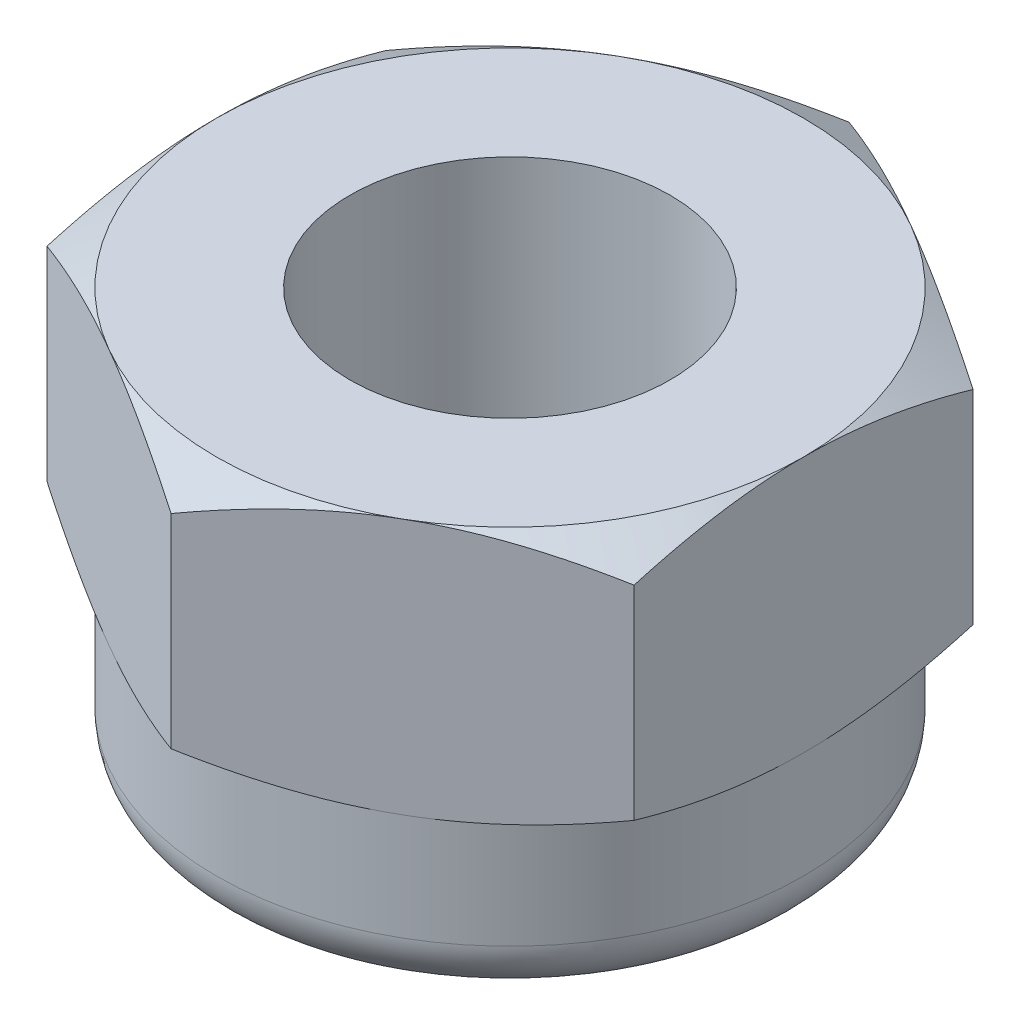
ISO-10303-21;
HEADER;
FILE_DESCRIPTION(('STEP AP214'),'2;1');
FILE_NAME('part.step','',(''),(''),'','','');
FILE_SCHEMA(('AUTOMOTIVE_DESIGN { 1 0 10303 214 1 1 1 1 }'));
ENDSEC;
DATA;
#1=APPLICATION_CONTEXT('core data for automotive mechanical design processes');
#2=APPLICATION_PROTOCOL_DEFINITION('international standard','automotive_design',2000,#1);
#3=PRODUCT_CONTEXT('',#1,'mechanical');
#4=PRODUCT('Part','Part','',(#3));
#5=PRODUCT_RELATED_PRODUCT_CATEGORY('part','',(#4));
#6=PRODUCT_DEFINITION_FORMATION('','',#4);
#7=PRODUCT_DEFINITION_CONTEXT('part definition',#1,'design');
#8=PRODUCT_DEFINITION('design','',#6,#7);
#9=PRODUCT_DEFINITION_SHAPE('','',#8);
#10=(LENGTH_UNIT() NAMED_UNIT(*) SI_UNIT(.MILLI.,.METRE.));
#11=(NAMED_UNIT(*) PLANE_ANGLE_UNIT() SI_UNIT($,.RADIAN.));
#12=(NAMED_UNIT(*) SI_UNIT($,.STERADIAN.) SOLID_ANGLE_UNIT());
#13=UNCERTAINTY_MEASURE_WITH_UNIT(LENGTH_MEASURE(1.E-05),#10,'distance_accuracy_value','');
#14=(GEOMETRIC_REPRESENTATION_CONTEXT(3) GLOBAL_UNCERTAINTY_ASSIGNED_CONTEXT((#13)) GLOBAL_UNIT_ASSIGNED_CONTEXT((#10,
#11,#12)) REPRESENTATION_CONTEXT('',''));
#15=CARTESIAN_POINT('',(0.,0.,0.));
#16=DIRECTION('',(0.,0.,1.));
#17=DIRECTION('',(1.,0.,0.));
#18=AXIS2_PLACEMENT_3D('',#15,#16,#17);
#19=CARTESIAN_POINT('',(2.75,2.4,1.58771324027147));
#20=DIRECTION('',(-1.,0.,0.));
#21=DIRECTION('',(0.,0.,1.));
#22=AXIS2_PLACEMENT_3D('',#19,#20,#21);
#23=PLANE('',#22);
#24=CARTESIAN_POINT('',(2.75,1.38093653958843,-4.34466851973618));
#25=CARTESIAN_POINT('',(2.75,1.32202064950724,-4.22386779698329));
#26=CARTESIAN_POINT('',(2.75,1.26364700999932,-4.10279820576392));
#27=CARTESIAN_POINT('',(2.75,1.1482876774291,-3.85997860192461));
#28=CARTESIAN_POINT('',(2.75,1.09130218842708,-3.73822849246315));
#29=CARTESIAN_POINT('',(2.75,0.978752723293785,-3.49331526441921));
#30=CARTESIAN_POINT('',(2.75,0.923197515155515,-3.37014810316777));
#31=CARTESIAN_POINT('',(2.75,0.814256244023592,-3.12286173431569));
#32=CARTESIAN_POINT('',(2.75,0.760870083644363,-2.99874256975606));
#33=CARTESIAN_POINT('',(2.75,0.655040057447403,-2.74504756832828));
#34=CARTESIAN_POINT('',(2.75,0.602692465793724,-2.61543135851998));
#35=CARTESIAN_POINT('',(2.75,0.501769184528043,-2.3547122248499));
#36=CARTESIAN_POINT('',(2.75,0.453193906922892,-2.22360914038081));
#37=CARTESIAN_POINT('',(2.75,0.361032320926383,-1.95992838631145));
#38=CARTESIAN_POINT('',(2.75,0.317436563028729,-1.82735405172156));
#39=CARTESIAN_POINT('',(2.75,0.236579903230572,-1.56030503468424));
#40=CARTESIAN_POINT('',(2.75,0.19931708834281,-1.42583093943772));
#41=CARTESIAN_POINT('',(2.75,0.13306472074465,-1.15567205992232));
#42=CARTESIAN_POINT('',(2.75,0.104027276748661,-1.01999923443433));
#43=CARTESIAN_POINT('',(2.75,0.0558064271323427,-0.74688545575803));
#44=CARTESIAN_POINT('',(2.75,0.0366219648340766,-0.60944469379236));
#45=CARTESIAN_POINT('',(2.75,0.00988438809777827,-0.335308015782439));
#46=CARTESIAN_POINT('',(2.75,0.00217562219202506,-0.198627665157731));
#47=CARTESIAN_POINT('',(2.75,-0.00137225152806814,0.0749013422897878));
#48=CARTESIAN_POINT('',(2.75,0.00278868640387965,0.211749999759228));
#49=CARTESIAN_POINT('',(2.75,0.0194575166846125,0.441773738270723));
#50=CARTESIAN_POINT('',(2.75,0.0289378796806116,0.535183717161857));
#51=CARTESIAN_POINT('',(2.75,0.0528801300146094,0.721369109747204));
#52=CARTESIAN_POINT('',(2.75,0.0673426297137116,0.814144444006141));
#53=CARTESIAN_POINT('',(2.75,0.117450471333739,1.09135512594781));
#54=CARTESIAN_POINT('',(2.75,0.159808531169033,1.27458276750907));
#55=CARTESIAN_POINT('',(2.75,0.258901006196716,1.64148663937185));
#56=CARTESIAN_POINT('',(2.75,0.315943538456145,1.82507634432752));
#57=CARTESIAN_POINT('',(2.75,0.408810753757667,2.09789707107598));
#58=CARTESIAN_POINT('',(2.75,0.440981048739553,2.1884033337036));
#59=CARTESIAN_POINT('',(2.75,0.507377444516064,2.3686579485815));
#60=CARTESIAN_POINT('',(2.75,0.541603508874817,2.45840631423238));
#61=CARTESIAN_POINT('',(2.75,0.630917375568816,2.68603060571207));
#62=CARTESIAN_POINT('',(2.75,0.687195514965079,2.82343831755756));
#63=CARTESIAN_POINT('',(2.75,0.802882890715629,3.09693392822121));
#64=CARTESIAN_POINT('',(2.75,0.862292397407977,3.23302171188218));
#65=CARTESIAN_POINT('',(2.75,0.983551766352992,3.50414955291982));
#66=CARTESIAN_POINT('',(2.75,1.04540233123311,3.63918929504804));
#67=CARTESIAN_POINT('',(2.75,1.17101091756355,3.90838031374437));
#68=CARTESIAN_POINT('',(2.75,1.23476899108964,4.04253156593401));
#69=CARTESIAN_POINT('',(2.75,1.42847314195053,4.44426655928707));
#70=CARTESIAN_POINT('',(2.75,1.56067980896763,4.71075917718014));
#71=CARTESIAN_POINT('',(2.75,1.82899066695537,5.24170253784735));
#72=CARTESIAN_POINT('',(2.75,1.96509418383273,5.50615362384512));
#73=CARTESIAN_POINT('',(2.75,2.22681256839317,6.00831212761472));
#74=CARTESIAN_POINT('',(2.75,2.35217952114007,6.24614899547915));
#75=CARTESIAN_POINT('',(2.75,2.60455330317852,6.72096498096079));
#76=CARTESIAN_POINT('',(2.75,2.73156021492778,6.95794405467475));
#77=CARTESIAN_POINT('',(2.75,2.98641132805265,7.43050913308614));
#78=CARTESIAN_POINT('',(2.75,3.11425174665986,7.66609718039577));
#79=CARTESIAN_POINT('',(2.75,3.37088488435897,8.13673291173544));
#80=CARTESIAN_POINT('',(2.75,3.49967753635213,8.37178063233783));
#81=CARTESIAN_POINT('',(2.75,3.62882004293521,8.60663456203462));
#82=B_SPLINE_CURVE_WITH_KNOTS('',3,(#24,#25,#26,#27,#28,#29,#30,#31,#32,#33,#34,#35,#36,#37,#38,
#39,#40,#41,#42,#43,#44,#45,#46,#47,#48,#49,#50,#51,#52,#53,#54,#55,#56,#57,#58,#59,#60,#61,#62,
#63,#64,#65,#66,#67,#68,#69,#70,#71,#72,#73,#74,#75,#76,#77,#78,#79,#80,#81),.UNSPECIFIED.,.F.,
.F.,(4,2,2,2,2,2,2,2,2,2,2,2,2,2,2,2,2,2,2,2,2,2,2,2,2,2,2,2,4),(0.,0.403210544384672,
0.806480007959044,1.21181340797903,1.61712858924554,2.03644659555967,2.45581033497737,
2.87436455094914,3.29279210898127,3.70873084748665,4.1246249695373,4.53482498455775,
4.94502658050672,5.22656210678562,5.50813224932743,6.07154932122723,6.64791901572732,
6.93606075698111,7.22419739279862,7.66960137467362,8.11504387247217,8.56061553390865,
9.00619937075532,9.89859388845236,10.7908349577555,11.5973926448137,12.4039910450292,
13.2081055813639,14.0121639860803),.UNSPECIFIED.);
#83=CARTESIAN_POINT('',(2.75,0.245620093061801,-1.58771324027157));
#84=VERTEX_POINT('',#83);
#85=CARTESIAN_POINT('',(2.75,0.,0.));
#86=VERTEX_POINT('',#85);
#87=EDGE_CURVE('E148',#84,#86,#82,.T.);
#88=ORIENTED_EDGE('',*,*,#87,.F.);
#89=DIRECTION('',(0.,-1.,0.));
#90=VECTOR('',#89,1.);
#91=CARTESIAN_POINT('',(2.75,2.4,-1.58771324027147));
#92=LINE('',#91,#90);
#93=CARTESIAN_POINT('',(2.75,2.15437990693814,-1.58771324027147));
#94=VERTEX_POINT('',#93);
#95=EDGE_CURVE('E157',#94,#84,#92,.T.);
#96=ORIENTED_EDGE('',*,*,#95,.F.);
#97=CARTESIAN_POINT('',(2.75,1.0190634604116,-4.34466851973617));
#98=CARTESIAN_POINT('',(2.75,1.07797935049279,-4.22386779698328));
#99=CARTESIAN_POINT('',(2.75,1.13635299000071,-4.10279820576392));
#100=CARTESIAN_POINT('',(2.75,1.25171232257092,-3.8599786019246));
#101=CARTESIAN_POINT('',(2.75,1.30869781157294,-3.73822849246315));
#102=CARTESIAN_POINT('',(2.75,1.42124727670623,-3.4933152644192));
#103=CARTESIAN_POINT('',(2.75,1.4768024848445,-3.37014810316777));
#104=CARTESIAN_POINT('',(2.75,1.58574375597642,-3.12286173431569));
#105=CARTESIAN_POINT('',(2.75,1.63912991635565,-2.99874256975605));
#106=CARTESIAN_POINT('',(2.75,1.74495994255261,-2.74504756832828));
#107=CARTESIAN_POINT('',(2.75,1.79730753420629,-2.61543135851997));
#108=CARTESIAN_POINT('',(2.75,1.89823081547197,-2.35471222484989));
#109=CARTESIAN_POINT('',(2.75,1.94680609307712,-2.22360914038081));
#110=CARTESIAN_POINT('',(2.75,2.03896767907362,-1.95992838631144));
#111=CARTESIAN_POINT('',(2.75,2.08256343697128,-1.82735405172156));
#112=CARTESIAN_POINT('',(2.75,2.16342009676943,-1.56030503468424));
#113=CARTESIAN_POINT('',(2.75,2.20068291165719,-1.42583093943771));
#114=CARTESIAN_POINT('',(2.75,2.26693527925535,-1.15567205992232));
#115=CARTESIAN_POINT('',(2.75,2.29597272325134,-1.01999923443432));
#116=CARTESIAN_POINT('',(2.75,2.34419357286766,-0.746885455758027));
#117=CARTESIAN_POINT('',(2.75,2.36337803516592,-0.609444693792359));
#118=CARTESIAN_POINT('',(2.75,2.39011561190222,-0.335308015782438));
#119=CARTESIAN_POINT('',(2.75,2.39782437780797,-0.198627665157731));
#120=CARTESIAN_POINT('',(2.75,2.40137225152807,0.0749013422897874));
#121=CARTESIAN_POINT('',(2.75,2.39721131359612,0.211749999759227));
#122=CARTESIAN_POINT('',(2.75,2.38054248331539,0.441773738270724));
#123=CARTESIAN_POINT('',(2.75,2.37106212031939,0.53518371716186));
#124=CARTESIAN_POINT('',(2.75,2.34711986998539,0.721369109747209));
#125=CARTESIAN_POINT('',(2.75,2.33265737028629,0.814144444006148));
#126=CARTESIAN_POINT('',(2.75,2.28254952866626,1.09135512594783));
#127=CARTESIAN_POINT('',(2.75,2.24019146883097,1.27458276750908));
#128=CARTESIAN_POINT('',(2.75,2.14109899380328,1.64148663937188));
#129=CARTESIAN_POINT('',(2.75,2.08405646154385,1.82507634432754));
#130=CARTESIAN_POINT('',(2.75,1.99118924624233,2.09789707107601));
#131=CARTESIAN_POINT('',(2.75,1.95901895126044,2.18840333370364));
#132=CARTESIAN_POINT('',(2.75,1.89262255548393,2.36865794858154));
#133=CARTESIAN_POINT('',(2.75,1.85839649112518,2.45840631423242));
#134=CARTESIAN_POINT('',(2.75,1.76908262443118,2.68603060571212));
#135=CARTESIAN_POINT('',(2.75,1.71280448503491,2.8234383175576));
#136=CARTESIAN_POINT('',(2.75,1.59711710928437,3.09693392822125));
#137=CARTESIAN_POINT('',(2.75,1.53770760259202,3.23302171188221));
#138=CARTESIAN_POINT('',(2.75,1.41644823364701,3.50414955291986));
#139=CARTESIAN_POINT('',(2.75,1.35459766876689,3.63918929504807));
#140=CARTESIAN_POINT('',(2.75,1.22898908243646,3.90838031374441));
#141=CARTESIAN_POINT('',(2.75,1.16523100891036,4.04253156593404));
#142=CARTESIAN_POINT('',(2.75,0.971526858049473,4.4442665592871));
#143=CARTESIAN_POINT('',(2.75,0.839320191032384,4.71075917718017));
#144=CARTESIAN_POINT('',(2.75,0.57100933304465,5.24170253784738));
#145=CARTESIAN_POINT('',(2.75,0.434905816167288,5.50615362384515));
#146=CARTESIAN_POINT('',(2.75,0.173187431606853,6.00831212761475));
#147=CARTESIAN_POINT('',(2.75,0.0478204788599549,6.24614899547918));
#148=CARTESIAN_POINT('',(2.75,-0.204553303178486,6.72096498096081));
#149=CARTESIAN_POINT('',(2.75,-0.331560214927751,6.95794405467478));
#150=CARTESIAN_POINT('',(2.75,-0.586411328052619,7.43050913308617));
#151=CARTESIAN_POINT('',(2.75,-0.714251746659822,7.6660971803958));
#152=CARTESIAN_POINT('',(2.75,-0.970884884358933,8.13673291173547));
#153=CARTESIAN_POINT('',(2.75,-1.09967753635209,8.37178063233786));
#154=CARTESIAN_POINT('',(2.75,-1.22882004293517,8.60663456203465));
#155=B_SPLINE_CURVE_WITH_KNOTS('',3,(#97,#98,#99,#100,#101,#102,#103,#104,#105,#106,#107,#108,
#109,#110,#111,#112,#113,#114,#115,#116,#117,#118,#119,#120,#121,#122,#123,#124,#125,#126,#127,
#128,#129,#130,#131,#132,#133,#134,#135,#136,#137,#138,#139,#140,#141,#142,#143,#144,#145,#146,
#147,#148,#149,#150,#151,#152,#153,#154),.UNSPECIFIED.,.F.,.F.,(4,2,2,2,2,2,2,2,2,2,2,2,2,2,2,2,
2,2,2,2,2,2,2,2,2,2,2,2,4),(0.,0.403210544384672,0.806480007959043,1.21181340797903,
1.61712858924554,2.03644659555967,2.45581033497736,2.87436455094914,3.29279210898126,
3.70873084748664,4.12462496953729,4.53482498455774,4.94502658050671,5.22656210678561,
5.50813224932743,6.07154932122724,6.64791901572734,6.93606075698113,7.22419739279865,
7.66960137467365,8.11504387247219,8.56061553390867,9.00619937075534,9.89859388845237,
10.7908349577555,11.5973926448137,12.4039910450292,13.2081055813639,14.0121639860803),.UNSPECIFIED.);
#156=CARTESIAN_POINT('',(2.75,2.4,0.));
#157=VERTEX_POINT('',#156);
#158=EDGE_CURVE('E222',#157,#94,#155,.F.);
#159=ORIENTED_EDGE('',*,*,#158,.F.);
#160=CARTESIAN_POINT('',(2.75,2.15437990693814,1.58771324027147));
#161=VERTEX_POINT('',#160);
#162=EDGE_CURVE('E229',#161,#157,#155,.F.);
#163=ORIENTED_EDGE('',*,*,#162,.F.);
#164=DIRECTION('',(0.,-1.,0.));
#165=VECTOR('',#164,1.);
#166=CARTESIAN_POINT('',(2.75,2.4,1.58771324027147));
#167=LINE('',#166,#165);
#168=CARTESIAN_POINT('',(2.75,0.245620093061863,1.58771324027147));
#169=VERTEX_POINT('',#168);
#170=EDGE_CURVE('E240',#161,#169,#167,.T.);
#171=ORIENTED_EDGE('',*,*,#170,.T.);
#172=EDGE_CURVE('E212',#86,#169,#82,.T.);
#173=ORIENTED_EDGE('',*,*,#172,.F.);
#174=EDGE_LOOP('',(#88,#96,#159,#163,#171,#173));
#175=FACE_BOUND('',#174,.T.);
#176=ADVANCED_FACE('F36',(#175),#23,.F.);
#177=CARTESIAN_POINT('',(2.75,2.4,-1.58771324027147));
#178=DIRECTION('',(-0.5,0.,0.866025403784439));
#179=DIRECTION('',(0.866025403784439,0.,0.5));
#180=AXIS2_PLACEMENT_3D('',#177,#178,#179);
#181=PLANE('',#180);
#182=CARTESIAN_POINT('',(-0.00019999999999982,0.245686763364762,-3.17554195059678));
#183=CARTESIAN_POINT('',(0.120649220659906,0.205387662249265,-3.10576962051743));
#184=CARTESIAN_POINT('',(0.242541602622634,0.168736902597664,-3.03539502097908));
#185=CARTESIAN_POINT('',(0.488437126727894,0.104762182969802,-2.89342717394439));
#186=CARTESIAN_POINT('',(0.612444638573857,0.0774608556744983,-2.82183140359858));
#187=CARTESIAN_POINT('',(0.858922797975945,0.0349617452941174,-2.67952717191842));
#188=CARTESIAN_POINT('',(0.981355518587419,0.0194811186224583,-2.60884060771577));
#189=CARTESIAN_POINT('',(1.22679714236892,0.000999397369940948,-2.46713482015518));
#190=CARTESIAN_POINT('',(1.34980515323291,-0.00201700053739971,-2.39611611197037));
#191=CARTESIAN_POINT('',(1.57965878661079,0.00425314542854748,-2.26341005486544));
#192=CARTESIAN_POINT('',(1.68653879125402,0.0120001542767032,-2.20170285541369));
#193=CARTESIAN_POINT('',(1.89960246733475,0.0365551810643558,-2.07869048467395));
#194=CARTESIAN_POINT('',(2.00578540164889,0.0533715896505713,-2.01738573896433));
#195=CARTESIAN_POINT('',(2.21928848939318,0.0954119223459575,-1.89411967378235));
#196=CARTESIAN_POINT('',(2.32658161614285,0.120814080687232,-1.83217395817123));
#197=CARTESIAN_POINT('',(2.53956747928405,0.178467225839983,-1.70920651275308));
#198=CARTESIAN_POINT('',(2.64526294502665,0.210704663298984,-1.64818320715446));
#199=CARTESIAN_POINT('',(2.7502,0.245686763364762,-1.58759777021763));
#200=B_SPLINE_CURVE_WITH_KNOTS('',3,(#182,#183,#184,#185,#186,#187,#188,#189,#190,#191,#192,
#193,#194,#195,#196,#197,#198,#199),.UNSPECIFIED.,.F.,.F.,(4,2,2,2,2,2,2,2,4),(0.,
0.435912828725889,0.872873557116333,1.29901931904672,1.72464171213574,2.09526089052938,
2.46622354066374,2.84541551798557,3.22386274754524),.UNSPECIFIED.);
#201=CARTESIAN_POINT('',(0.,0.245620093061864,-3.17542648054294));
#202=VERTEX_POINT('',#201);
#203=CARTESIAN_POINT('',(1.375,0.,-2.38156986040721));
#204=VERTEX_POINT('',#203);
#205=EDGE_CURVE('E135',#202,#204,#200,.T.);
#206=ORIENTED_EDGE('',*,*,#205,.F.);
#207=DIRECTION('',(0.,-1.,0.));
#208=VECTOR('',#207,1.);
#209=CARTESIAN_POINT('',(0.,2.4,-3.17542648054294));
#210=LINE('',#209,#208);
#211=CARTESIAN_POINT('',(0.,2.15437990693814,-3.17542648054294));
#212=VERTEX_POINT('',#211);
#213=EDGE_CURVE('E252',#212,#202,#210,.T.);
#214=ORIENTED_EDGE('',*,*,#213,.F.);
#215=CARTESIAN_POINT('',(2.7502,2.15431323663524,-1.58759777021763));
#216=CARTESIAN_POINT('',(2.62935077934009,2.19461233775074,-1.65737010029699));
#217=CARTESIAN_POINT('',(2.50745839737737,2.23126309740234,-1.72774469983533));
#218=CARTESIAN_POINT('',(2.26156287327211,2.2952378170302,-1.86971254687003));
#219=CARTESIAN_POINT('',(2.13755536142614,2.3225391443255,-1.94130831721583));
#220=CARTESIAN_POINT('',(1.89107720202406,2.36503825470588,-2.08361254889599));
#221=CARTESIAN_POINT('',(1.76864448141258,2.38051888137754,-2.15429911309864));
#222=CARTESIAN_POINT('',(1.52320285763109,2.39900060263006,-2.29600490065923));
#223=CARTESIAN_POINT('',(1.40019484676709,2.4020170005374,-2.36702360884404));
#224=CARTESIAN_POINT('',(1.17034121338921,2.39574685457145,-2.49972966594897));
#225=CARTESIAN_POINT('',(1.06346120874598,2.3879998457233,-2.56143686540073));
#226=CARTESIAN_POINT('',(0.850397532665251,2.36344481893564,-2.68444923614047));
#227=CARTESIAN_POINT('',(0.744214598351112,2.34662841034943,-2.74575398185008));
#228=CARTESIAN_POINT('',(0.530711510606817,2.30458807765404,-2.86902004703206));
#229=CARTESIAN_POINT('',(0.423418383857146,2.27918591931277,-2.93096576264318));
#230=CARTESIAN_POINT('',(0.210432520715949,2.22153277416002,-3.05393320806134));
#231=CARTESIAN_POINT('',(0.104737054973348,2.18929533670102,-3.11495651365995));
#232=CARTESIAN_POINT('',(-0.000199999999999935,2.15431323663524,-3.17554195059678));
#233=B_SPLINE_CURVE_WITH_KNOTS('',3,(#215,#216,#217,#218,#219,#220,#221,#222,#223,#224,#225,
#226,#227,#228,#229,#230,#231,#232),.UNSPECIFIED.,.F.,.F.,(4,2,2,2,2,2,2,2,4),(0.,
0.435912828725888,0.872873557116331,1.29901931904671,1.72464171213573,2.09526089052937,
2.46622354066374,2.84541551798557,3.22386274754524),.UNSPECIFIED.);
#234=CARTESIAN_POINT('',(1.375,2.4,-2.38156986040721));
#235=VERTEX_POINT('',#234);
#236=EDGE_CURVE('E231',#235,#212,#233,.T.);
#237=ORIENTED_EDGE('',*,*,#236,.F.);
#238=EDGE_CURVE('E230',#94,#235,#233,.T.);
#239=ORIENTED_EDGE('',*,*,#238,.F.);
#240=ORIENTED_EDGE('',*,*,#95,.T.);
#241=EDGE_CURVE('E143',#204,#84,#200,.T.);
#242=ORIENTED_EDGE('',*,*,#241,.F.);
#243=EDGE_LOOP('',(#206,#214,#237,#239,#240,#242));
#244=FACE_BOUND('',#243,.T.);
#245=ADVANCED_FACE('F154',(#244),#181,.F.);
#246=CARTESIAN_POINT('',(0.,2.4,-3.17542648054294));
#247=DIRECTION('',(0.5,0.,0.866025403784439));
#248=DIRECTION('',(0.866025403784439,0.,-0.5));
#249=AXIS2_PLACEMENT_3D('',#246,#247,#248);
#250=PLANE('',#249);
#251=CARTESIAN_POINT('',(-2.7502,0.245686763364762,-1.58759777021763));
#252=CARTESIAN_POINT('',(-2.62935077934009,0.205387662249265,-1.65737010029699));
#253=CARTESIAN_POINT('',(-2.50745839737737,0.168736902597663,-1.72774469983533));
#254=CARTESIAN_POINT('',(-2.26156287327211,0.104762182969802,-1.86971254687003));
#255=CARTESIAN_POINT('',(-2.13755536142614,0.0774608556744985,-1.94130831721583));
#256=CARTESIAN_POINT('',(-1.89107720202405,0.0349617452941177,-2.08361254889599));
#257=CARTESIAN_POINT('',(-1.76864448141258,0.0194811186224585,-2.15429911309864));
#258=CARTESIAN_POINT('',(-1.52320285763108,0.000999397369940889,-2.29600490065923));
#259=CARTESIAN_POINT('',(-1.40019484676709,-0.00201700053739993,-2.36702360884404));
#260=CARTESIAN_POINT('',(-1.1703412133892,0.00425314542854732,-2.49972966594897));
#261=CARTESIAN_POINT('',(-1.06346120874598,0.0120001542767032,-2.56143686540073));
#262=CARTESIAN_POINT('',(-0.850397532665249,0.0365551810643559,-2.68444923614047));
#263=CARTESIAN_POINT('',(-0.744214598351109,0.0533715896505714,-2.74575398185008));
#264=CARTESIAN_POINT('',(-0.530711510606815,0.0954119223459575,-2.86902004703206));
#265=CARTESIAN_POINT('',(-0.423418383857144,0.120814080687232,-2.93096576264318));
#266=CARTESIAN_POINT('',(-0.210432520715948,0.178467225839983,-3.05393320806134));
#267=CARTESIAN_POINT('',(-0.104737054973347,0.210704663298984,-3.11495651365995));
#268=CARTESIAN_POINT('',(0.000200000000000052,0.245686763364762,-3.17554195059678));
#269=B_SPLINE_CURVE_WITH_KNOTS('',3,(#251,#252,#253,#254,#255,#256,#257,#258,#259,#260,#261,
#262,#263,#264,#265,#266,#267,#268),.UNSPECIFIED.,.F.,.F.,(4,2,2,2,2,2,2,2,4),(0.,
0.435912828725889,0.872873557116334,1.29901931904672,1.72464171213574,2.09526089052938,
2.46622354066374,2.84541551798557,3.22386274754524),.UNSPECIFIED.);
#270=CARTESIAN_POINT('',(-2.75,0.245620093061801,-1.58771324027157));
#271=VERTEX_POINT('',#270);
#272=CARTESIAN_POINT('',(-1.375,0.,-2.38156986040721));
#273=VERTEX_POINT('',#272);
#274=EDGE_CURVE('E309',#271,#273,#269,.T.);
#275=ORIENTED_EDGE('',*,*,#274,.F.);
#276=DIRECTION('',(0.,-1.,0.));
#277=VECTOR('',#276,1.);
#278=CARTESIAN_POINT('',(-2.75,2.4,-1.58771324027147));
#279=LINE('',#278,#277);
#280=CARTESIAN_POINT('',(-2.75,2.1543799069382,-1.58771324027157));
#281=VERTEX_POINT('',#280);
#282=EDGE_CURVE('E249',#281,#271,#279,.T.);
#283=ORIENTED_EDGE('',*,*,#282,.F.);
#284=CARTESIAN_POINT('',(0.000200000000000107,2.15431323663524,-3.17554195059678));
#285=CARTESIAN_POINT('',(-0.120649220659906,2.19461233775074,-3.10576962051743));
#286=CARTESIAN_POINT('',(-0.242541602622634,2.23126309740234,-3.03539502097908));
#287=CARTESIAN_POINT('',(-0.488437126727892,2.2952378170302,-2.89342717394439));
#288=CARTESIAN_POINT('',(-0.612444638573855,2.3225391443255,-2.82183140359858));
#289=CARTESIAN_POINT('',(-0.858922797975943,2.36503825470588,-2.67952717191842));
#290=CARTESIAN_POINT('',(-0.981355518587416,2.38051888137754,-2.60884060771577));
#291=CARTESIAN_POINT('',(-1.22679714236891,2.39900060263006,-2.46713482015519));
#292=CARTESIAN_POINT('',(-1.34980515323291,2.4020170005374,-2.39611611197038));
#293=CARTESIAN_POINT('',(-1.57965878661079,2.39574685457145,-2.26341005486544));
#294=CARTESIAN_POINT('',(-1.68653879125402,2.3879998457233,-2.20170285541369));
#295=CARTESIAN_POINT('',(-1.89960246733475,2.36344481893564,-2.07869048467395));
#296=CARTESIAN_POINT('',(-2.00578540164889,2.34662841034943,-2.01738573896433));
#297=CARTESIAN_POINT('',(-2.21928848939318,2.30458807765404,-1.89411967378235));
#298=CARTESIAN_POINT('',(-2.32658161614285,2.27918591931277,-1.83217395817123));
#299=CARTESIAN_POINT('',(-2.53956747928405,2.22153277416002,-1.70920651275308));
#300=CARTESIAN_POINT('',(-2.64526294502665,2.18929533670102,-1.64818320715446));
#301=CARTESIAN_POINT('',(-2.7502,2.15431323663524,-1.58759777021763));
#302=B_SPLINE_CURVE_WITH_KNOTS('',3,(#284,#285,#286,#287,#288,#289,#290,#291,#292,#293,#294,
#295,#296,#297,#298,#299,#300,#301),.UNSPECIFIED.,.F.,.F.,(4,2,2,2,2,2,2,2,4),(0.,
0.435912828725888,0.872873557116331,1.29901931904671,1.72464171213573,2.09526089052937,
2.46622354066374,2.84541551798557,3.22386274754524),.UNSPECIFIED.);
#303=CARTESIAN_POINT('',(-1.375,2.4,-2.38156986040721));
#304=VERTEX_POINT('',#303);
#305=EDGE_CURVE('E291',#304,#281,#302,.T.);
#306=ORIENTED_EDGE('',*,*,#305,.F.);
#307=EDGE_CURVE('E296',#212,#304,#302,.T.);
#308=ORIENTED_EDGE('',*,*,#307,.F.);
#309=ORIENTED_EDGE('',*,*,#213,.T.);
#310=EDGE_CURVE('E137',#273,#202,#269,.T.);
#311=ORIENTED_EDGE('',*,*,#310,.F.);
#312=EDGE_LOOP('',(#275,#283,#306,#308,#309,#311));
#313=FACE_BOUND('',#312,.T.);
#314=ADVANCED_FACE('F297',(#313),#250,.F.);
#315=CARTESIAN_POINT('',(-2.75,2.4,-1.58771324027147));
#316=DIRECTION('',(1.,0.,0.));
#317=DIRECTION('',(0.,0.,-1.));
#318=AXIS2_PLACEMENT_3D('',#315,#316,#317);
#319=PLANE('',#318);
#320=CARTESIAN_POINT('',(-2.75,1.38093653748996,-4.34466851543462));
#321=CARTESIAN_POINT('',(-2.75,1.32202064749606,-4.22386779282652));
#322=CARTESIAN_POINT('',(-2.75,1.26364700807538,-4.10279820175204));
#323=CARTESIAN_POINT('',(-2.75,1.14828767567924,-3.85997859820294));
#324=CARTESIAN_POINT('',(-2.75,1.09130218676404,-3.73822848888681));
#325=CARTESIAN_POINT('',(-2.75,0.978752721804428,-3.49331526113567));
#326=CARTESIAN_POINT('',(-2.75,0.923197513753003,-3.37014810003172));
#327=CARTESIAN_POINT('',(-2.75,0.814256242793355,-3.1228617314756));
#328=CARTESIAN_POINT('',(-2.75,0.760870082499554,-2.99874256706443));
#329=CARTESIAN_POINT('',(-2.75,0.655040056476304,-2.74504756594581));
#330=CARTESIAN_POINT('',(-2.75,0.602692464910696,-2.61543135629829));
#331=CARTESIAN_POINT('',(-2.75,0.501769183816527,-2.35471222295232));
#332=CARTESIAN_POINT('',(-2.75,0.453193906294815,-2.22360913864656));
#333=CARTESIAN_POINT('',(-2.75,0.361032320457336,-1.95992838490687));
#334=CARTESIAN_POINT('',(-2.75,0.317436562635296,-1.82735405048331));
#335=CARTESIAN_POINT('',(-2.75,0.236579902976239,-1.56030503378314));
#336=CARTESIAN_POINT('',(-2.75,0.19931708815197,-1.42583093870743));
#337=CARTESIAN_POINT('',(-2.75,0.133064720682126,-1.1556720596198));
#338=CARTESIAN_POINT('',(-2.75,0.104027276746229,-1.01999923438993));
#339=CARTESIAN_POINT('',(-2.75,0.0558064272113853,-0.746885456236262));
#340=CARTESIAN_POINT('',(-2.75,0.0366219649345328,-0.609444694535093));
#341=CARTESIAN_POINT('',(-2.75,0.00988438819379768,-0.335308017049834));
#342=CARTESIAN_POINT('',(-2.75,0.00217562226308968,-0.198627666685229));
#343=CARTESIAN_POINT('',(-2.75,-0.00137225155275854,0.0749013402458655));
#344=CARTESIAN_POINT('',(-2.75,0.00278868630837913,0.211749997458984));
#345=CARTESIAN_POINT('',(-2.75,0.0194575164456935,0.441773735650865));
#346=CARTESIAN_POINT('',(-2.75,0.0289378793850357,0.535183714475791));
#347=CARTESIAN_POINT('',(-2.75,0.0528801296027435,0.721369106931754));
#348=CARTESIAN_POINT('',(-2.75,0.0673426292422124,0.814144441127516));
#349=CARTESIAN_POINT('',(-2.75,0.117450470682126,1.09135512288322));
#350=CARTESIAN_POINT('',(-2.75,0.159808530395801,1.27458276432552));
#351=CARTESIAN_POINT('',(-2.75,0.258901005183362,1.64148663594934));
#352=CARTESIAN_POINT('',(-2.75,0.315943537324216,1.82507634078515));
#353=CARTESIAN_POINT('',(-2.75,0.408810752454267,2.09789706735471));
#354=CARTESIAN_POINT('',(-2.75,0.440981047380104,2.18840332992296));
#355=CARTESIAN_POINT('',(-2.75,0.507377443046532,2.36865794468211));
#356=CARTESIAN_POINT('',(-2.75,0.541603507351249,2.45840631027363));
#357=CARTESIAN_POINT('',(-2.75,0.630917373955131,2.68603060171686));
#358=CARTESIAN_POINT('',(-2.75,0.687195513320008,2.8234383135838));
#359=CARTESIAN_POINT('',(-2.75,0.802882889016021,3.09693392428772));
#360=CARTESIAN_POINT('',(-2.75,0.862292395685221,3.2330217079675));
#361=CARTESIAN_POINT('',(-2.75,0.983551764590068,3.50414954904077));
#362=CARTESIAN_POINT('',(-2.75,1.04540232945317,3.6391892911858));
#363=CARTESIAN_POINT('',(-2.75,1.17101091575408,3.90838030991399));
#364=CARTESIAN_POINT('',(-2.75,1.23476898926765,4.04253156211866));
#365=CARTESIAN_POINT('',(-2.75,1.42847314009673,4.4442665555164));
#366=CARTESIAN_POINT('',(-2.75,1.56067980709955,4.71075917343698));
#367=CARTESIAN_POINT('',(-2.75,1.8289906650663,5.24170253415536));
#368=CARTESIAN_POINT('',(-2.75,1.96509418193694,5.50615362017679));
#369=CARTESIAN_POINT('',(-2.75,2.22681256648019,6.00831212397214));
#370=CARTESIAN_POINT('',(-2.75,2.35217951921604,6.24614899183894));
#371=CARTESIAN_POINT('',(-2.75,2.60455330123481,6.72096497732419));
#372=CARTESIAN_POINT('',(-2.75,2.73156021297546,6.95794405103938));
#373=CARTESIAN_POINT('',(-2.75,2.98641132608302,7.43050912944912));
#374=CARTESIAN_POINT('',(-2.75,3.11425174468152,7.66609717675587));
#375=CARTESIAN_POINT('',(-2.75,3.37088488236435,8.13673290808909));
#376=CARTESIAN_POINT('',(-2.75,3.49967753434993,8.37178062868791));
#377=CARTESIAN_POINT('',(-2.75,3.62882004092582,8.60663455838092));
#378=B_SPLINE_CURVE_WITH_KNOTS('',3,(#320,#321,#322,#323,#324,#325,#326,#327,#328,#329,#330,
#331,#332,#333,#334,#335,#336,#337,#338,#339,#340,#341,#342,#343,#344,#345,#346,#347,#348,#349,
#350,#351,#352,#353,#354,#355,#356,#357,#358,#359,#360,#361,#362,#363,#364,#365,#366,#367,#368,
#369,#370,#371,#372,#373,#374,#375,#376,#377),.UNSPECIFIED.,.F.,.F.,(4,2,2,2,2,2,2,2,2,2,2,2,2,
2,2,2,2,2,2,2,2,2,2,2,2,2,2,2,4),(0.,0.403210543879464,0.806480006948555,1.21181340645808,
1.61712858721417,2.03644659298216,2.45581033185353,2.8743645472807,3.29279210476866,
3.70873084248075,4.12462496373927,4.53482497798788,4.94502657316468,5.22656209922885,
5.5081322415559,6.07154931302527,6.64791900707559,6.93606074810517,7.22419738369845,
7.66960136559704,8.1150438634194,8.56061552488039,9.00619936175164,9.89859387950334,
10.7908349488603,11.5973926359093,12.4039910361159,13.2081055724305,14.0121639771266),.UNSPECIFIED.);
#379=CARTESIAN_POINT('',(-2.75,0.245620093061864,1.58771324027147));
#380=VERTEX_POINT('',#379);
#381=CARTESIAN_POINT('',(-2.75,0.,0.));
#382=VERTEX_POINT('',#381);
#383=EDGE_CURVE('E158',#380,#382,#378,.F.);
#384=ORIENTED_EDGE('',*,*,#383,.F.);
#385=DIRECTION('',(0.,-1.,0.));
#386=VECTOR('',#385,1.);
#387=CARTESIAN_POINT('',(-2.75,2.4,1.58771324027147));
#388=LINE('',#387,#386);
#389=CARTESIAN_POINT('',(-2.75,2.15437990693814,1.58771324027147));
#390=VERTEX_POINT('',#389);
#391=EDGE_CURVE('E246',#390,#380,#388,.T.);
#392=ORIENTED_EDGE('',*,*,#391,.F.);
#393=CARTESIAN_POINT('',(-2.75,1.01906346251007,-4.34466851543462));
#394=CARTESIAN_POINT('',(-2.75,1.07797935250396,-4.22386779282652));
#395=CARTESIAN_POINT('',(-2.75,1.13635299192464,-4.10279820175204));
#396=CARTESIAN_POINT('',(-2.75,1.25171232432079,-3.85997859820294));
#397=CARTESIAN_POINT('',(-2.75,1.30869781323598,-3.73822848888681));
#398=CARTESIAN_POINT('',(-2.75,1.42124727819559,-3.49331526113566));
#399=CARTESIAN_POINT('',(-2.75,1.47680248624701,-3.37014810003172));
#400=CARTESIAN_POINT('',(-2.75,1.58574375720666,-3.1228617314756));
#401=CARTESIAN_POINT('',(-2.75,1.63912991750046,-2.99874256706443));
#402=CARTESIAN_POINT('',(-2.75,1.74495994352371,-2.7450475659458));
#403=CARTESIAN_POINT('',(-2.75,1.79730753508932,-2.61543135629828));
#404=CARTESIAN_POINT('',(-2.75,1.89823081618348,-2.35471222295231));
#405=CARTESIAN_POINT('',(-2.75,1.94680609370519,-2.22360913864656));
#406=CARTESIAN_POINT('',(-2.75,2.03896767954267,-1.95992838490686));
#407=CARTESIAN_POINT('',(-2.75,2.08256343736471,-1.82735405048331));
#408=CARTESIAN_POINT('',(-2.75,2.16342009702377,-1.56030503378313));
#409=CARTESIAN_POINT('',(-2.75,2.20068291184803,-1.42583093870743));
#410=CARTESIAN_POINT('',(-2.75,2.26693527931788,-1.1556720596198));
#411=CARTESIAN_POINT('',(-2.75,2.29597272325377,-1.01999923438993));
#412=CARTESIAN_POINT('',(-2.75,2.34419357278862,-0.746885456236262));
#413=CARTESIAN_POINT('',(-2.75,2.36337803506547,-0.609444694535093));
#414=CARTESIAN_POINT('',(-2.75,2.3901156118062,-0.335308017049834));
#415=CARTESIAN_POINT('',(-2.75,2.39782437773691,-0.198627666685229));
#416=CARTESIAN_POINT('',(-2.75,2.40137225155276,0.0749013402458643));
#417=CARTESIAN_POINT('',(-2.75,2.39721131369162,0.211749997458982));
#418=CARTESIAN_POINT('',(-2.75,2.38054248355431,0.441773735650866));
#419=CARTESIAN_POINT('',(-2.75,2.37106212061496,0.535183714475794));
#420=CARTESIAN_POINT('',(-2.75,2.34711987039726,0.721369106931761));
#421=CARTESIAN_POINT('',(-2.75,2.33265737075779,0.814144441127525));
#422=CARTESIAN_POINT('',(-2.75,2.28254952931787,1.09135512288323));
#423=CARTESIAN_POINT('',(-2.75,2.2401914696042,1.27458276432554));
#424=CARTESIAN_POINT('',(-2.75,2.14109899481663,1.64148663594937));
#425=CARTESIAN_POINT('',(-2.75,2.08405646267578,1.82507634078518));
#426=CARTESIAN_POINT('',(-2.75,1.99118924754573,2.09789706735475));
#427=CARTESIAN_POINT('',(-2.75,1.95901895261989,2.188403329923));
#428=CARTESIAN_POINT('',(-2.75,1.89262255695346,2.36865794468215));
#429=CARTESIAN_POINT('',(-2.75,1.85839649264874,2.45840631027367));
#430=CARTESIAN_POINT('',(-2.75,1.76908262604486,2.6860306017169));
#431=CARTESIAN_POINT('',(-2.75,1.71280448667999,2.82343831358384));
#432=CARTESIAN_POINT('',(-2.75,1.59711711098397,3.09693392428776));
#433=CARTESIAN_POINT('',(-2.75,1.53770760431478,3.23302170796754));
#434=CARTESIAN_POINT('',(-2.75,1.41644823540993,3.50414954904081));
#435=CARTESIAN_POINT('',(-2.75,1.35459767054683,3.63918929118584));
#436=CARTESIAN_POINT('',(-2.75,1.22898908424593,3.90838030991403));
#437=CARTESIAN_POINT('',(-2.75,1.16523101073235,4.0425315621187));
#438=CARTESIAN_POINT('',(-2.75,0.971526859903279,4.44426655551643));
#439=CARTESIAN_POINT('',(-2.75,0.839320192900461,4.71075917343701));
#440=CARTESIAN_POINT('',(-2.75,0.571009334933717,5.24170253415539));
#441=CARTESIAN_POINT('',(-2.75,0.434905818063079,5.50615362017682));
#442=CARTESIAN_POINT('',(-2.75,0.173187433519829,6.00831212397216));
#443=CARTESIAN_POINT('',(-2.75,0.0478204807839855,6.24614899183897));
#444=CARTESIAN_POINT('',(-2.75,-0.204553301234783,6.72096497732422));
#445=CARTESIAN_POINT('',(-2.75,-0.33156021297543,6.95794405103941));
#446=CARTESIAN_POINT('',(-2.75,-0.586411326082989,7.43050912944915));
#447=CARTESIAN_POINT('',(-2.75,-0.714251744681478,7.6660971767559));
#448=CARTESIAN_POINT('',(-2.75,-0.970884882364307,8.13673290808912));
#449=CARTESIAN_POINT('',(-2.75,-1.09967753434989,8.37178062868794));
#450=CARTESIAN_POINT('',(-2.75,-1.22882004092578,8.60663455838095));
#451=B_SPLINE_CURVE_WITH_KNOTS('',3,(#393,#394,#395,#396,#397,#398,#399,#400,#401,#402,#403,
#404,#405,#406,#407,#408,#409,#410,#411,#412,#413,#414,#415,#416,#417,#418,#419,#420,#421,#422,
#423,#424,#425,#426,#427,#428,#429,#430,#431,#432,#433,#434,#435,#436,#437,#438,#439,#440,#441,
#442,#443,#444,#445,#446,#447,#448,#449,#450),.UNSPECIFIED.,.F.,.F.,(4,2,2,2,2,2,2,2,2,2,2,2,2,
2,2,2,2,2,2,2,2,2,2,2,2,2,2,2,4),(0.,0.403210543879463,0.806480006948555,1.21181340645808,
1.61712858721417,2.03644659298216,2.45581033185353,2.8743645472807,3.29279210476865,
3.70873084248074,4.12462496373925,4.53482497798787,4.94502657316467,5.22656209922884,
5.5081322415559,6.07154931302528,6.64791900707561,6.9360607481052,7.22419738369848,
7.66960136559707,8.11504386341942,8.56061552488042,9.00619936175165,9.89859387950335,
10.7908349488603,11.5973926359093,12.4039910361159,13.2081055724305,14.0121639771266),.UNSPECIFIED.);
#452=CARTESIAN_POINT('',(-2.75,2.4,0.));
#453=VERTEX_POINT('',#452);
#454=EDGE_CURVE('E285',#453,#390,#451,.T.);
#455=ORIENTED_EDGE('',*,*,#454,.F.);
#456=EDGE_CURVE('E290',#281,#453,#451,.T.);
#457=ORIENTED_EDGE('',*,*,#456,.F.);
#458=ORIENTED_EDGE('',*,*,#282,.T.);
#459=EDGE_CURVE('E142',#382,#271,#378,.F.);
#460=ORIENTED_EDGE('',*,*,#459,.F.);
#461=EDGE_LOOP('',(#384,#392,#455,#457,#458,#460));
#462=FACE_BOUND('',#461,.T.);
#463=ADVANCED_FACE('F272',(#462),#319,.F.);
#464=CARTESIAN_POINT('',(-2.75,2.4,1.58771324027147));
#465=DIRECTION('',(0.5,0.,-0.866025403784439));
#466=DIRECTION('',(-0.866025403784439,0.,-0.5));
#467=AXIS2_PLACEMENT_3D('',#464,#465,#466);
#468=PLANE('',#467);
#469=CARTESIAN_POINT('',(0.000200000000000006,0.245686763364762,3.17554195059678));
#470=CARTESIAN_POINT('',(-0.120649220659906,0.205387662249265,3.10576962051743));
#471=CARTESIAN_POINT('',(-0.242541602622634,0.168736902597663,3.03539502097908));
#472=CARTESIAN_POINT('',(-0.488437126727893,0.104762182969802,2.89342717394439));
#473=CARTESIAN_POINT('',(-0.612444638573856,0.0774608556744982,2.82183140359858));
#474=CARTESIAN_POINT('',(-0.858922797975945,0.0349617452941173,2.67952717191842));
#475=CARTESIAN_POINT('',(-0.981355518587418,0.0194811186224581,2.60884060771577));
#476=CARTESIAN_POINT('',(-1.22679714236892,0.00099939736994076,2.46713482015518));
#477=CARTESIAN_POINT('',(-1.34980515323291,-0.00201700053739986,2.39611611197037));
#478=CARTESIAN_POINT('',(-1.57965878661079,0.00425314542854726,2.26341005486544));
#479=CARTESIAN_POINT('',(-1.68653879125402,0.0120001542767029,2.20170285541368));
#480=CARTESIAN_POINT('',(-1.89960246733475,0.0365551810643555,2.07869048467395));
#481=CARTESIAN_POINT('',(-2.00578540164889,0.0533715896505712,2.01738573896433));
#482=CARTESIAN_POINT('',(-2.21928848939318,0.0954119223459575,1.89411967378235));
#483=CARTESIAN_POINT('',(-2.32658161614286,0.120814080687232,1.83217395817123));
#484=CARTESIAN_POINT('',(-2.53956747928405,0.178467225839983,1.70920651275307));
#485=CARTESIAN_POINT('',(-2.64526294502665,0.210704663298984,1.64818320715446));
#486=CARTESIAN_POINT('',(-2.7502,0.245686763364762,1.58759777021763));
#487=B_SPLINE_CURVE_WITH_KNOTS('',3,(#469,#470,#471,#472,#473,#474,#475,#476,#477,#478,#479,
#480,#481,#482,#483,#484,#485,#486),.UNSPECIFIED.,.F.,.F.,(4,2,2,2,2,2,2,2,4),(0.,
0.435912828725889,0.872873557116334,1.29901931904672,1.72464171213574,2.09526089052938,
2.46622354066374,2.84541551798557,3.22386274754524),.UNSPECIFIED.);
#488=CARTESIAN_POINT('',(0.,0.245620093061864,3.17542648054294));
#489=VERTEX_POINT('',#488);
#490=CARTESIAN_POINT('',(-1.375,0.,2.38156986040721));
#491=VERTEX_POINT('',#490);
#492=EDGE_CURVE('E205',#489,#491,#487,.T.);
#493=ORIENTED_EDGE('',*,*,#492,.F.);
#494=DIRECTION('',(0.,-1.,0.));
#495=VECTOR('',#494,1.);
#496=CARTESIAN_POINT('',(0.,2.4,3.17542648054294));
#497=LINE('',#496,#495);
#498=CARTESIAN_POINT('',(0.,2.15437990693814,3.17542648054294));
#499=VERTEX_POINT('',#498);
#500=EDGE_CURVE('E243',#499,#489,#497,.T.);
#501=ORIENTED_EDGE('',*,*,#500,.F.);
#502=CARTESIAN_POINT('',(-2.7502,2.15431323663524,1.58759777021763));
#503=CARTESIAN_POINT('',(-2.62935077934009,2.19461233775074,1.65737010029699));
#504=CARTESIAN_POINT('',(-2.50745839737737,2.23126309740234,1.72774469983533));
#505=CARTESIAN_POINT('',(-2.26156287327211,2.2952378170302,1.86971254687003));
#506=CARTESIAN_POINT('',(-2.13755536142614,2.3225391443255,1.94130831721583));
#507=CARTESIAN_POINT('',(-1.89107720202406,2.36503825470588,2.08361254889599));
#508=CARTESIAN_POINT('',(-1.76864448141258,2.38051888137754,2.15429911309864));
#509=CARTESIAN_POINT('',(-1.52320285763109,2.39900060263006,2.29600490065923));
#510=CARTESIAN_POINT('',(-1.40019484676709,2.4020170005374,2.36702360884404));
#511=CARTESIAN_POINT('',(-1.17034121338921,2.39574685457145,2.49972966594897));
#512=CARTESIAN_POINT('',(-1.06346120874598,2.3879998457233,2.56143686540073));
#513=CARTESIAN_POINT('',(-0.850397532665251,2.36344481893564,2.68444923614047));
#514=CARTESIAN_POINT('',(-0.744214598351112,2.34662841034943,2.74575398185008));
#515=CARTESIAN_POINT('',(-0.530711510606817,2.30458807765404,2.86902004703206));
#516=CARTESIAN_POINT('',(-0.423418383857145,2.27918591931277,2.93096576264318));
#517=CARTESIAN_POINT('',(-0.210432520715949,2.22153277416002,3.05393320806134));
#518=CARTESIAN_POINT('',(-0.104737054973347,2.18929533670102,3.11495651365995));
#519=CARTESIAN_POINT('',(0.000200000000000241,2.15431323663524,3.17554195059678));
#520=B_SPLINE_CURVE_WITH_KNOTS('',3,(#502,#503,#504,#505,#506,#507,#508,#509,#510,#511,#512,
#513,#514,#515,#516,#517,#518,#519),.UNSPECIFIED.,.F.,.F.,(4,2,2,2,2,2,2,2,4),(0.,
0.435912828725888,0.872873557116331,1.29901931904671,1.72464171213573,2.09526089052937,
2.46622354066374,2.84541551798557,3.22386274754524),.UNSPECIFIED.);
#521=CARTESIAN_POINT('',(-1.375,2.4,2.38156986040721));
#522=VERTEX_POINT('',#521);
#523=EDGE_CURVE('E277',#522,#499,#520,.T.);
#524=ORIENTED_EDGE('',*,*,#523,.F.);
#525=EDGE_CURVE('E283',#390,#522,#520,.T.);
#526=ORIENTED_EDGE('',*,*,#525,.F.);
#527=ORIENTED_EDGE('',*,*,#391,.T.);
#528=EDGE_CURVE('E160',#491,#380,#487,.T.);
#529=ORIENTED_EDGE('',*,*,#528,.F.);
#530=EDGE_LOOP('',(#493,#501,#524,#526,#527,#529));
#531=FACE_BOUND('',#530,.T.);
#532=ADVANCED_FACE('F267',(#531),#468,.F.);
#533=CARTESIAN_POINT('',(0.,2.4,3.17542648054294));
#534=DIRECTION('',(-0.5,0.,-0.866025403784439));
#535=DIRECTION('',(-0.866025403784439,0.,0.5));
#536=AXIS2_PLACEMENT_3D('',#533,#534,#535);
#537=PLANE('',#536);
#538=CARTESIAN_POINT('',(2.7502,0.245686763364762,1.58759777021763));
#539=CARTESIAN_POINT('',(2.62935077934009,0.205387662249265,1.65737010029699));
#540=CARTESIAN_POINT('',(2.50745839737736,0.168736902597663,1.72774469983533));
#541=CARTESIAN_POINT('',(2.26156287327211,0.104762182969802,1.86971254687003));
#542=CARTESIAN_POINT('',(2.13755536142614,0.0774608556744978,1.94130831721583));
#543=CARTESIAN_POINT('',(1.89107720202405,0.0349617452941171,2.08361254889599));
#544=CARTESIAN_POINT('',(1.76864448141258,0.0194811186224583,2.15429911309864));
#545=CARTESIAN_POINT('',(1.52320285763108,0.000999397369941006,2.29600490065923));
#546=CARTESIAN_POINT('',(1.40019484676709,-0.00201700053739982,2.36702360884404));
#547=CARTESIAN_POINT('',(1.1703412133892,0.00425314542854734,2.49972966594897));
#548=CARTESIAN_POINT('',(1.06346120874598,0.0120001542767032,2.56143686540073));
#549=CARTESIAN_POINT('',(0.850397532665248,0.0365551810643558,2.68444923614047));
#550=CARTESIAN_POINT('',(0.744214598351109,0.0533715896505713,2.74575398185008));
#551=CARTESIAN_POINT('',(0.530711510606815,0.0954119223459575,2.86902004703206));
#552=CARTESIAN_POINT('',(0.423418383857144,0.120814080687232,2.93096576264318));
#553=CARTESIAN_POINT('',(0.210432520715948,0.178467225839984,3.05393320806134));
#554=CARTESIAN_POINT('',(0.104737054973347,0.210704663298984,3.11495651365995));
#555=CARTESIAN_POINT('',(-0.000200000000000304,0.245686763364762,3.17554195059678));
#556=B_SPLINE_CURVE_WITH_KNOTS('',3,(#538,#539,#540,#541,#542,#543,#544,#545,#546,#547,#548,
#549,#550,#551,#552,#553,#554,#555),.UNSPECIFIED.,.F.,.F.,(4,2,2,2,2,2,2,2,4),(0.,
0.435912828725889,0.872873557116333,1.29901931904672,1.72464171213574,2.09526089052938,
2.46622354066374,2.84541551798557,3.22386274754524),.UNSPECIFIED.);
#557=CARTESIAN_POINT('',(1.375,0.,2.38156986040721));
#558=VERTEX_POINT('',#557);
#559=EDGE_CURVE('E386',#169,#558,#556,.T.);
#560=ORIENTED_EDGE('',*,*,#559,.F.);
#561=ORIENTED_EDGE('',*,*,#170,.F.);
#562=CARTESIAN_POINT('',(-0.000200000000000032,2.15431323663524,3.17554195059678));
#563=CARTESIAN_POINT('',(0.120649220659906,2.19461233775074,3.10576962051743));
#564=CARTESIAN_POINT('',(0.242541602622634,2.23126309740234,3.03539502097908));
#565=CARTESIAN_POINT('',(0.488437126727892,2.2952378170302,2.89342717394439));
#566=CARTESIAN_POINT('',(0.612444638573855,2.3225391443255,2.82183140359858));
#567=CARTESIAN_POINT('',(0.858922797975943,2.36503825470588,2.67952717191842));
#568=CARTESIAN_POINT('',(0.981355518587416,2.38051888137754,2.60884060771577));
#569=CARTESIAN_POINT('',(1.22679714236891,2.39900060263006,2.46713482015519));
#570=CARTESIAN_POINT('',(1.34980515323291,2.4020170005374,2.39611611197038));
#571=CARTESIAN_POINT('',(1.57965878661079,2.39574685457145,2.26341005486544));
#572=CARTESIAN_POINT('',(1.68653879125402,2.3879998457233,2.20170285541369));
#573=CARTESIAN_POINT('',(1.89960246733475,2.36344481893564,2.07869048467395));
#574=CARTESIAN_POINT('',(2.00578540164889,2.34662841034943,2.01738573896434));
#575=CARTESIAN_POINT('',(2.21928848939318,2.30458807765404,1.89411967378235));
#576=CARTESIAN_POINT('',(2.32658161614285,2.27918591931277,1.83217395817123));
#577=CARTESIAN_POINT('',(2.53956747928405,2.22153277416002,1.70920651275308));
#578=CARTESIAN_POINT('',(2.64526294502665,2.18929533670102,1.64818320715446));
#579=CARTESIAN_POINT('',(2.7502,2.15431323663524,1.58759777021763));
#580=B_SPLINE_CURVE_WITH_KNOTS('',3,(#562,#563,#564,#565,#566,#567,#568,#569,#570,#571,#572,
#573,#574,#575,#576,#577,#578,#579),.UNSPECIFIED.,.F.,.F.,(4,2,2,2,2,2,2,2,4),(0.,
0.435912828725888,0.872873557116331,1.29901931904671,1.72464171213573,2.09526089052937,
2.46622354066374,2.84541551798557,3.22386274754524),.UNSPECIFIED.);
#581=CARTESIAN_POINT('',(1.375,2.4,2.38156986040721));
#582=VERTEX_POINT('',#581);
#583=EDGE_CURVE('E255',#582,#161,#580,.T.);
#584=ORIENTED_EDGE('',*,*,#583,.F.);
#585=EDGE_CURVE('E260',#499,#582,#580,.T.);
#586=ORIENTED_EDGE('',*,*,#585,.F.);
#587=ORIENTED_EDGE('',*,*,#500,.T.);
#588=EDGE_CURVE('E150',#558,#489,#556,.T.);
#589=ORIENTED_EDGE('',*,*,#588,.F.);
#590=EDGE_LOOP('',(#560,#561,#584,#586,#587,#589));
#591=FACE_BOUND('',#590,.T.);
#592=ADVANCED_FACE('F262',(#591),#537,.F.);
#593=CARTESIAN_POINT('',(0.,2.4,0.));
#594=DIRECTION('',(0.,1.,0.));
#595=DIRECTION('',(0.,0.,1.));
#596=AXIS2_PLACEMENT_3D('',#593,#594,#595);
#597=PLANE('',#596);
#598=CARTESIAN_POINT('',(0.,2.4,0.));
#599=DIRECTION('',(0.,1.,0.));
#600=DIRECTION('',(0.,0.,1.));
#601=AXIS2_PLACEMENT_3D('',#598,#599,#600);
#602=CIRCLE('',#601,1.5);
#603=CARTESIAN_POINT('',(0.,2.4,1.5));
#604=VERTEX_POINT('',#603);
#605=EDGE_CURVE('E237',#604,#604,#602,.T.);
#606=ORIENTED_EDGE('',*,*,#605,.F.);
#607=EDGE_LOOP('',(#606));
#608=FACE_BOUND('',#607,.T.);
#609=CARTESIAN_POINT('',(0.,2.4,0.));
#610=DIRECTION('',(0.,-1.,0.));
#611=DIRECTION('',(0.,0.,-1.));
#612=AXIS2_PLACEMENT_3D('',#609,#610,#611);
#613=CIRCLE('',#612,2.75);
#614=EDGE_CURVE('E332',#582,#522,#613,.T.);
#615=ORIENTED_EDGE('',*,*,#614,.F.);
#616=EDGE_CURVE('E328',#157,#582,#613,.T.);
#617=ORIENTED_EDGE('',*,*,#616,.F.);
#618=EDGE_CURVE('E284',#235,#157,#613,.T.);
#619=ORIENTED_EDGE('',*,*,#618,.F.);
#620=EDGE_CURVE('E59',#304,#235,#613,.T.);
#621=ORIENTED_EDGE('',*,*,#620,.F.);
#622=EDGE_CURVE('E320',#453,#304,#613,.T.);
#623=ORIENTED_EDGE('',*,*,#622,.F.);
#624=EDGE_CURVE('E327',#522,#453,#613,.T.);
#625=ORIENTED_EDGE('',*,*,#624,.F.);
#626=EDGE_LOOP('',(#615,#617,#619,#621,#623,#625));
#627=FACE_BOUND('',#626,.T.);
#628=ADVANCED_FACE('F266',(#608,#627),#597,.T.);
#629=CARTESIAN_POINT('',(0.,2.4,0.));
#630=DIRECTION('',(0.,-1.,0.));
#631=DIRECTION('',(0.,0.,-1.));
#632=AXIS2_PLACEMENT_3D('',#629,#630,#631);
#633=CYLINDRICAL_SURFACE('',#632,1.5);
#634=ORIENTED_EDGE('',*,*,#605,.T.);
#635=EDGE_LOOP('',(#634));
#636=FACE_BOUND('',#635,.T.);
#637=CARTESIAN_POINT('',(0.,-1.5,0.));
#638=DIRECTION('',(0.,-1.,0.));
#639=DIRECTION('',(0.,0.,-1.));
#640=AXIS2_PLACEMENT_3D('',#637,#638,#639);
#641=CIRCLE('',#640,1.5);
#642=CARTESIAN_POINT('',(0.,-1.5,-1.5));
#643=VERTEX_POINT('',#642);
#644=EDGE_CURVE('E151',#643,#643,#641,.T.);
#645=ORIENTED_EDGE('',*,*,#644,.T.);
#646=EDGE_LOOP('',(#645));
#647=FACE_BOUND('',#646,.T.);
#648=ADVANCED_FACE('F390',(#636,#647),#633,.F.);
#649=CARTESIAN_POINT('',(0.,1.20000000000001,0.));
#650=DIRECTION('',(0.,-1.,0.));
#651=DIRECTION('',(0.,0.,-1.));
#652=AXIS2_PLACEMENT_3D('',#649,#650,#651);
#653=CONICAL_SURFACE('',#652,4.82846096908266,1.0471975511966);
#654=ORIENTED_EDGE('',*,*,#162,.T.);
#655=ORIENTED_EDGE('',*,*,#616,.T.);
#656=ORIENTED_EDGE('',*,*,#583,.T.);
#657=EDGE_LOOP('',(#654,#655,#656));
#658=FACE_BOUND('',#657,.T.);
#659=ADVANCED_FACE('F191',(#658),#653,.T.);
#660=ORIENTED_EDGE('',*,*,#523,.T.);
#661=ORIENTED_EDGE('',*,*,#585,.T.);
#662=ORIENTED_EDGE('',*,*,#614,.T.);
#663=EDGE_LOOP('',(#660,#661,#662));
#664=FACE_BOUND('',#663,.T.);
#665=ADVANCED_FACE('F344',(#664),#653,.T.);
#666=ORIENTED_EDGE('',*,*,#454,.T.);
#667=ORIENTED_EDGE('',*,*,#525,.T.);
#668=ORIENTED_EDGE('',*,*,#624,.T.);
#669=EDGE_LOOP('',(#666,#667,#668));
#670=FACE_BOUND('',#669,.T.);
#671=ADVANCED_FACE('F338',(#670),#653,.T.);
#672=ORIENTED_EDGE('',*,*,#305,.T.);
#673=ORIENTED_EDGE('',*,*,#456,.T.);
#674=ORIENTED_EDGE('',*,*,#622,.T.);
#675=EDGE_LOOP('',(#672,#673,#674));
#676=FACE_BOUND('',#675,.T.);
#677=ADVANCED_FACE('F319',(#676),#653,.T.);
#678=ORIENTED_EDGE('',*,*,#236,.T.);
#679=ORIENTED_EDGE('',*,*,#307,.T.);
#680=ORIENTED_EDGE('',*,*,#620,.T.);
#681=EDGE_LOOP('',(#678,#679,#680));
#682=FACE_BOUND('',#681,.T.);
#683=ADVANCED_FACE('F397',(#682),#653,.T.);
#684=ORIENTED_EDGE('',*,*,#158,.T.);
#685=ORIENTED_EDGE('',*,*,#238,.T.);
#686=ORIENTED_EDGE('',*,*,#618,.T.);
#687=EDGE_LOOP('',(#684,#685,#686));
#688=FACE_BOUND('',#687,.T.);
#689=ADVANCED_FACE('F380',(#688),#653,.T.);
#690=CARTESIAN_POINT('',(0.,0.,0.));
#691=DIRECTION('',(0.,1.,0.));
#692=DIRECTION('',(0.,0.,1.));
#693=AXIS2_PLACEMENT_3D('',#690,#691,#692);
#694=CONICAL_SURFACE('',#693,2.75,1.0471975511966);
#695=ORIENTED_EDGE('',*,*,#492,.T.);
#696=CARTESIAN_POINT('',(0.,0.,0.));
#697=DIRECTION('',(0.,1.,0.));
#698=DIRECTION('',(0.,0.,1.));
#699=AXIS2_PLACEMENT_3D('',#696,#697,#698);
#700=CIRCLE('',#699,2.75);
#701=EDGE_CURVE('E261',#491,#558,#700,.T.);
#702=ORIENTED_EDGE('',*,*,#701,.T.);
#703=ORIENTED_EDGE('',*,*,#588,.T.);
#704=EDGE_LOOP('',(#695,#702,#703));
#705=FACE_BOUND('',#704,.T.);
#706=ADVANCED_FACE('F189',(#705),#694,.T.);
#707=ORIENTED_EDGE('',*,*,#383,.T.);
#708=EDGE_CURVE('E349',#382,#491,#700,.T.);
#709=ORIENTED_EDGE('',*,*,#708,.T.);
#710=ORIENTED_EDGE('',*,*,#528,.T.);
#711=EDGE_LOOP('',(#707,#709,#710));
#712=FACE_BOUND('',#711,.T.);
#713=ADVANCED_FACE('F187',(#712),#694,.T.);
#714=ORIENTED_EDGE('',*,*,#274,.T.);
#715=EDGE_CURVE('E128',#273,#382,#700,.T.);
#716=ORIENTED_EDGE('',*,*,#715,.T.);
#717=ORIENTED_EDGE('',*,*,#459,.T.);
#718=EDGE_LOOP('',(#714,#716,#717));
#719=FACE_BOUND('',#718,.T.);
#720=ADVANCED_FACE('F182',(#719),#694,.T.);
#721=ORIENTED_EDGE('',*,*,#310,.T.);
#722=ORIENTED_EDGE('',*,*,#205,.T.);
#723=EDGE_CURVE('E124',#204,#273,#700,.T.);
#724=ORIENTED_EDGE('',*,*,#723,.T.);
#725=EDGE_LOOP('',(#721,#722,#724));
#726=FACE_BOUND('',#725,.T.);
#727=ADVANCED_FACE('F136',(#726),#694,.T.);
#728=ORIENTED_EDGE('',*,*,#241,.T.);
#729=ORIENTED_EDGE('',*,*,#87,.T.);
#730=CARTESIAN_POINT('',(0.,0.,0.));
#731=DIRECTION('',(0.,-1.,0.));
#732=DIRECTION('',(0.,0.,-1.));
#733=AXIS2_PLACEMENT_3D('',#730,#731,#732);
#734=CIRCLE('',#733,2.75);
#735=EDGE_CURVE('E51',#204,#86,#734,.T.);
#736=ORIENTED_EDGE('',*,*,#735,.F.);
#737=EDGE_LOOP('',(#728,#729,#736));
#738=FACE_BOUND('',#737,.T.);
#739=ADVANCED_FACE('F146',(#738),#694,.T.);
#740=ORIENTED_EDGE('',*,*,#172,.T.);
#741=ORIENTED_EDGE('',*,*,#559,.T.);
#742=EDGE_CURVE('E132',#558,#86,#700,.T.);
#743=ORIENTED_EDGE('',*,*,#742,.T.);
#744=EDGE_LOOP('',(#740,#741,#743));
#745=FACE_BOUND('',#744,.T.);
#746=ADVANCED_FACE('F372',(#745),#694,.T.);
#747=CARTESIAN_POINT('',(0.,-1.5,0.));
#748=DIRECTION('',(0.,-1.,0.));
#749=DIRECTION('',(0.,0.,-1.));
#750=AXIS2_PLACEMENT_3D('',#747,#748,#749);
#751=PLANE('',#750);
#752=CARTESIAN_POINT('',(0.,-1.5,0.));
#753=DIRECTION('',(0.,-1.,0.));
#754=DIRECTION('',(0.,0.,-1.));
#755=AXIS2_PLACEMENT_3D('',#752,#753,#754);
#756=CIRCLE('',#755,2.25);
#757=CARTESIAN_POINT('',(0.,-1.5,-2.25));
#758=VERTEX_POINT('',#757);
#759=EDGE_CURVE('E44',#758,#758,#756,.T.);
#760=ORIENTED_EDGE('',*,*,#759,.T.);
#761=EDGE_LOOP('',(#760));
#762=FACE_BOUND('',#761,.T.);
#763=ORIENTED_EDGE('',*,*,#644,.F.);
#764=EDGE_LOOP('',(#763));
#765=FACE_BOUND('',#764,.T.);
#766=ADVANCED_FACE('F359',(#762,#765),#751,.T.);
#767=CARTESIAN_POINT('',(0.,-1.5,0.));
#768=DIRECTION('',(0.,1.,0.));
#769=DIRECTION('',(0.,0.,1.));
#770=AXIS2_PLACEMENT_3D('',#767,#768,#769);
#771=CYLINDRICAL_SURFACE('',#770,2.75);
#772=CARTESIAN_POINT('',(0.,-1.,0.));
#773=DIRECTION('',(0.,-1.,0.));
#774=DIRECTION('',(0.,0.,-1.));
#775=AXIS2_PLACEMENT_3D('',#772,#773,#774);
#776=CIRCLE('',#775,2.75);
#777=CARTESIAN_POINT('',(0.,-1.,-2.75));
#778=VERTEX_POINT('',#777);
#779=EDGE_CURVE('E11',#778,#778,#776,.F.);
#780=ORIENTED_EDGE('',*,*,#779,.T.);
#781=EDGE_LOOP('',(#780));
#782=FACE_BOUND('',#781,.T.);
#783=ORIENTED_EDGE('',*,*,#735,.T.);
#784=ORIENTED_EDGE('',*,*,#742,.F.);
#785=ORIENTED_EDGE('',*,*,#701,.F.);
#786=ORIENTED_EDGE('',*,*,#708,.F.);
#787=ORIENTED_EDGE('',*,*,#715,.F.);
#788=ORIENTED_EDGE('',*,*,#723,.F.);
#789=EDGE_LOOP('',(#783,#784,#785,#786,#787,#788));
#790=FACE_BOUND('',#789,.T.);
#791=ADVANCED_FACE('F126',(#782,#790),#771,.T.);
#792=CARTESIAN_POINT('',(0.,-1.,0.));
#793=DIRECTION('',(0.,-1.,0.));
#794=DIRECTION('',(0.,0.,-1.));
#795=AXIS2_PLACEMENT_3D('',#792,#793,#794);
#796=TOROIDAL_SURFACE('',#795,2.25,0.5);
#797=ORIENTED_EDGE('',*,*,#779,.F.);
#798=EDGE_LOOP('',(#797));
#799=FACE_BOUND('',#798,.T.);
#800=ORIENTED_EDGE('',*,*,#759,.F.);
#801=EDGE_LOOP('',(#800));
#802=FACE_BOUND('',#801,.T.);
#803=ADVANCED_FACE('F38',(#799,#802),#796,.T.);
#804=CLOSED_SHELL('',(#176,#245,#314,#463,#532,#592,#628,#648,#659,#665,#671,#677,#683,#689,
#706,#713,#720,#727,#739,#746,#766,#791,#803));
#805=MANIFOLD_SOLID_BREP('B2',#804);
#806=ADVANCED_BREP_SHAPE_REPRESENTATION('',(#18,#805),#14);
#807=SHAPE_DEFINITION_REPRESENTATION(#9,#806);
ENDSEC;
END-ISO-10303-21;
